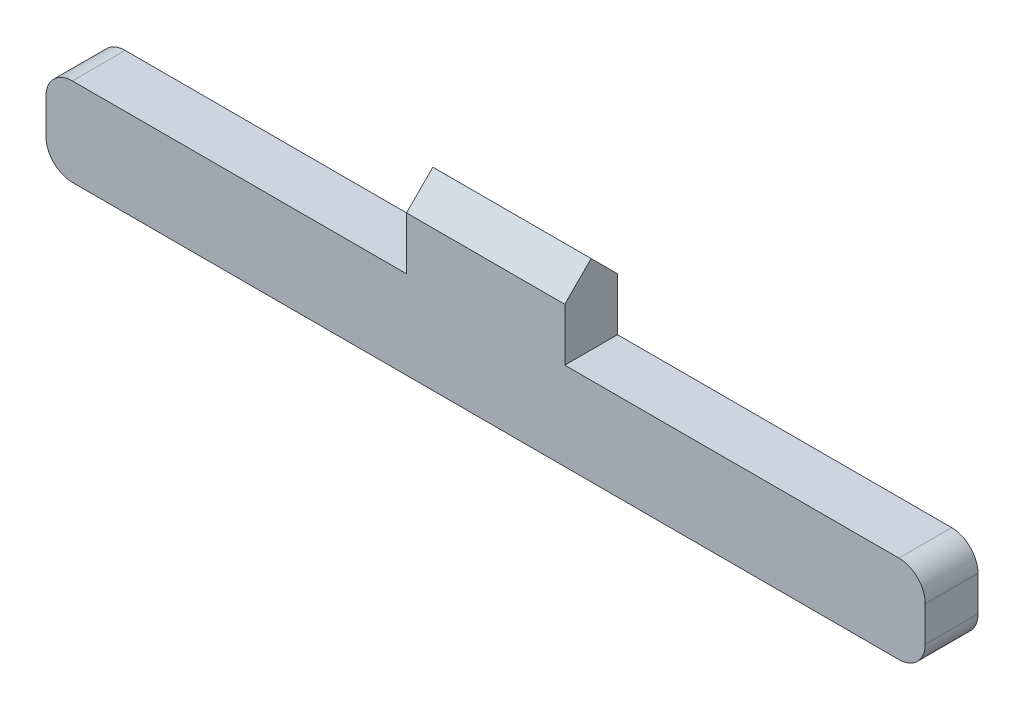
ISO-10303-21;
HEADER;
FILE_DESCRIPTION(('STEP AP214'),'2;1');
FILE_NAME('part.step','',(''),(''),'','','');
FILE_SCHEMA(('AUTOMOTIVE_DESIGN { 1 0 10303 214 1 1 1 1 }'));
ENDSEC;
DATA;
#1=APPLICATION_CONTEXT('core data for automotive mechanical design processes');
#2=APPLICATION_PROTOCOL_DEFINITION('international standard','automotive_design',2000,#1);
#3=PRODUCT_CONTEXT('',#1,'mechanical');
#4=PRODUCT('Part','Part','',(#3));
#5=PRODUCT_RELATED_PRODUCT_CATEGORY('part','',(#4));
#6=PRODUCT_DEFINITION_FORMATION('','',#4);
#7=PRODUCT_DEFINITION_CONTEXT('part definition',#1,'design');
#8=PRODUCT_DEFINITION('design','',#6,#7);
#9=PRODUCT_DEFINITION_SHAPE('','',#8);
#10=(LENGTH_UNIT() NAMED_UNIT(*) SI_UNIT(.MILLI.,.METRE.));
#11=(NAMED_UNIT(*) PLANE_ANGLE_UNIT() SI_UNIT($,.RADIAN.));
#12=(NAMED_UNIT(*) SI_UNIT($,.STERADIAN.) SOLID_ANGLE_UNIT());
#13=UNCERTAINTY_MEASURE_WITH_UNIT(LENGTH_MEASURE(1.E-05),#10,'distance_accuracy_value','');
#14=(GEOMETRIC_REPRESENTATION_CONTEXT(3) GLOBAL_UNCERTAINTY_ASSIGNED_CONTEXT((#13)) GLOBAL_UNIT_ASSIGNED_CONTEXT((#10,
#11,#12)) REPRESENTATION_CONTEXT('',''));
#15=CARTESIAN_POINT('',(0.,0.,0.));
#16=DIRECTION('',(0.,0.,1.));
#17=DIRECTION('',(1.,0.,0.));
#18=AXIS2_PLACEMENT_3D('',#15,#16,#17);
#19=CARTESIAN_POINT('',(-9.,10.,6.));
#20=DIRECTION('',(1.,0.,0.));
#21=DIRECTION('',(0.,1.,0.));
#22=AXIS2_PLACEMENT_3D('',#19,#20,#21);
#23=PLANE('',#22);
#24=DIRECTION('',(0.,-1.,0.));
#25=VECTOR('',#24,1.);
#26=CARTESIAN_POINT('',(-9.,10.,6.));
#27=LINE('',#26,#25);
#28=CARTESIAN_POINT('',(-9.,16.,6.));
#29=VERTEX_POINT('',#28);
#30=CARTESIAN_POINT('',(-9.,10.,6.));
#31=VERTEX_POINT('',#30);
#32=EDGE_CURVE('E133',#29,#31,#27,.T.);
#33=ORIENTED_EDGE('',*,*,#32,.F.);
#34=DIRECTION('',(0.,0.707106781186547,-0.707106781186548));
#35=VECTOR('',#34,1.);
#36=CARTESIAN_POINT('',(-9.,16.,6.));
#37=LINE('',#36,#35);
#38=CARTESIAN_POINT('',(-9.,19.,3.00000000000002));
#39=VERTEX_POINT('',#38);
#40=EDGE_CURVE('E201',#29,#39,#37,.T.);
#41=ORIENTED_EDGE('',*,*,#40,.T.);
#42=DIRECTION('',(0.,0.707106781186547,0.707106781186548));
#43=VECTOR('',#42,1.);
#44=CARTESIAN_POINT('',(-9.,19.,3.00000000000002));
#45=LINE('',#44,#43);
#46=CARTESIAN_POINT('',(-9.,16.,0.));
#47=VERTEX_POINT('',#46);
#48=EDGE_CURVE('E199',#39,#47,#45,.F.);
#49=ORIENTED_EDGE('',*,*,#48,.T.);
#50=DIRECTION('',(0.,-1.,0.));
#51=VECTOR('',#50,1.);
#52=CARTESIAN_POINT('',(-9.,10.,0.));
#53=LINE('',#52,#51);
#54=CARTESIAN_POINT('',(-9.,10.,0.));
#55=VERTEX_POINT('',#54);
#56=EDGE_CURVE('E154',#47,#55,#53,.T.);
#57=ORIENTED_EDGE('',*,*,#56,.T.);
#58=DIRECTION('',(0.,0.,-1.));
#59=VECTOR('',#58,1.);
#60=CARTESIAN_POINT('',(-9.,10.,6.));
#61=LINE('',#60,#59);
#62=EDGE_CURVE('E149',#31,#55,#61,.T.);
#63=ORIENTED_EDGE('',*,*,#62,.F.);
#64=EDGE_LOOP('',(#33,#41,#49,#57,#63));
#65=FACE_BOUND('',#64,.T.);
#66=ADVANCED_FACE('F35',(#65),#23,.F.);
#67=CARTESIAN_POINT('',(-50.,9.99999999999999,6.));
#68=DIRECTION('',(0.,-1.,0.));
#69=DIRECTION('',(1.,0.,0.));
#70=AXIS2_PLACEMENT_3D('',#67,#68,#69);
#71=PLANE('',#70);
#72=DIRECTION('',(-1.,0.,0.));
#73=VECTOR('',#72,1.);
#74=CARTESIAN_POINT('',(-50.,9.99999999999999,0.));
#75=LINE('',#74,#73);
#76=CARTESIAN_POINT('',(-47.,9.99999999999999,0.));
#77=VERTEX_POINT('',#76);
#78=EDGE_CURVE('E216',#55,#77,#75,.T.);
#79=ORIENTED_EDGE('',*,*,#78,.T.);
#80=DIRECTION('',(0.,0.,-1.));
#81=VECTOR('',#80,1.);
#82=CARTESIAN_POINT('',(-47.,9.99999999999999,6.));
#83=LINE('',#82,#81);
#84=CARTESIAN_POINT('',(-47.,9.99999999999999,6.));
#85=VERTEX_POINT('',#84);
#86=EDGE_CURVE('E151',#77,#85,#83,.F.);
#87=ORIENTED_EDGE('',*,*,#86,.T.);
#88=DIRECTION('',(-1.,0.,0.));
#89=VECTOR('',#88,1.);
#90=CARTESIAN_POINT('',(-50.,9.99999999999999,6.));
#91=LINE('',#90,#89);
#92=EDGE_CURVE('E137',#31,#85,#91,.T.);
#93=ORIENTED_EDGE('',*,*,#92,.F.);
#94=ORIENTED_EDGE('',*,*,#62,.T.);
#95=EDGE_LOOP('',(#79,#87,#93,#94));
#96=FACE_BOUND('',#95,.T.);
#97=ADVANCED_FACE('F148',(#96),#71,.F.);
#98=CARTESIAN_POINT('',(-50.,0.,6.));
#99=DIRECTION('',(1.,0.,0.));
#100=DIRECTION('',(0.,0.,-1.));
#101=AXIS2_PLACEMENT_3D('',#98,#99,#100);
#102=PLANE('',#101);
#103=DIRECTION('',(0.,-1.,0.));
#104=VECTOR('',#103,1.);
#105=CARTESIAN_POINT('',(-50.,0.,0.));
#106=LINE('',#105,#104);
#107=CARTESIAN_POINT('',(-50.,6.99999999999999,0.));
#108=VERTEX_POINT('',#107);
#109=CARTESIAN_POINT('',(-50.,3.,0.));
#110=VERTEX_POINT('',#109);
#111=EDGE_CURVE('E218',#108,#110,#106,.T.);
#112=ORIENTED_EDGE('',*,*,#111,.T.);
#113=DIRECTION('',(0.,0.,-1.));
#114=VECTOR('',#113,1.);
#115=CARTESIAN_POINT('',(-50.,3.,6.));
#116=LINE('',#115,#114);
#117=CARTESIAN_POINT('',(-50.,3.,6.));
#118=VERTEX_POINT('',#117);
#119=EDGE_CURVE('E179',#110,#118,#116,.F.);
#120=ORIENTED_EDGE('',*,*,#119,.T.);
#121=DIRECTION('',(0.,-1.,0.));
#122=VECTOR('',#121,1.);
#123=CARTESIAN_POINT('',(-50.,0.,6.));
#124=LINE('',#123,#122);
#125=CARTESIAN_POINT('',(-50.,6.99999999999999,6.));
#126=VERTEX_POINT('',#125);
#127=EDGE_CURVE('E152',#126,#118,#124,.T.);
#128=ORIENTED_EDGE('',*,*,#127,.F.);
#129=DIRECTION('',(0.,0.,-1.));
#130=VECTOR('',#129,1.);
#131=CARTESIAN_POINT('',(-50.,6.99999999999999,6.));
#132=LINE('',#131,#130);
#133=EDGE_CURVE('E176',#126,#108,#132,.T.);
#134=ORIENTED_EDGE('',*,*,#133,.T.);
#135=EDGE_LOOP('',(#112,#120,#128,#134));
#136=FACE_BOUND('',#135,.T.);
#137=ADVANCED_FACE('F285',(#136),#102,.F.);
#138=CARTESIAN_POINT('',(-50.,0.,6.));
#139=DIRECTION('',(0.,1.,0.));
#140=DIRECTION('',(-1.,0.,0.));
#141=AXIS2_PLACEMENT_3D('',#138,#139,#140);
#142=PLANE('',#141);
#143=DIRECTION('',(1.,0.,0.));
#144=VECTOR('',#143,1.);
#145=CARTESIAN_POINT('',(-50.,0.,6.));
#146=LINE('',#145,#144);
#147=CARTESIAN_POINT('',(-47.,0.,6.));
#148=VERTEX_POINT('',#147);
#149=CARTESIAN_POINT('',(47.,0.,6.));
#150=VERTEX_POINT('',#149);
#151=EDGE_CURVE('E249',#148,#150,#146,.T.);
#152=ORIENTED_EDGE('',*,*,#151,.F.);
#153=DIRECTION('',(0.,0.,-1.));
#154=VECTOR('',#153,1.);
#155=CARTESIAN_POINT('',(-47.,0.,6.));
#156=LINE('',#155,#154);
#157=CARTESIAN_POINT('',(-47.,0.,0.));
#158=VERTEX_POINT('',#157);
#159=EDGE_CURVE('E159',#148,#158,#156,.T.);
#160=ORIENTED_EDGE('',*,*,#159,.T.);
#161=DIRECTION('',(1.,0.,0.));
#162=VECTOR('',#161,1.);
#163=CARTESIAN_POINT('',(-50.,0.,0.));
#164=LINE('',#163,#162);
#165=CARTESIAN_POINT('',(47.,0.,0.));
#166=VERTEX_POINT('',#165);
#167=EDGE_CURVE('E224',#158,#166,#164,.T.);
#168=ORIENTED_EDGE('',*,*,#167,.T.);
#169=DIRECTION('',(0.,0.,-1.));
#170=VECTOR('',#169,1.);
#171=CARTESIAN_POINT('',(47.,0.,6.));
#172=LINE('',#171,#170);
#173=EDGE_CURVE('E156',#166,#150,#172,.F.);
#174=ORIENTED_EDGE('',*,*,#173,.T.);
#175=EDGE_LOOP('',(#152,#160,#168,#174));
#176=FACE_BOUND('',#175,.T.);
#177=ADVANCED_FACE('F265',(#176),#142,.F.);
#178=CARTESIAN_POINT('',(50.,0.,6.));
#179=DIRECTION('',(-1.,0.,0.));
#180=DIRECTION('',(0.,0.,1.));
#181=AXIS2_PLACEMENT_3D('',#178,#179,#180);
#182=PLANE('',#181);
#183=DIRECTION('',(0.,1.,0.));
#184=VECTOR('',#183,1.);
#185=CARTESIAN_POINT('',(50.,0.,6.));
#186=LINE('',#185,#184);
#187=CARTESIAN_POINT('',(50.,3.00000000000001,6.));
#188=VERTEX_POINT('',#187);
#189=CARTESIAN_POINT('',(50.,7.00000000000001,6.));
#190=VERTEX_POINT('',#189);
#191=EDGE_CURVE('E245',#188,#190,#186,.T.);
#192=ORIENTED_EDGE('',*,*,#191,.F.);
#193=DIRECTION('',(0.,0.,-1.));
#194=VECTOR('',#193,1.);
#195=CARTESIAN_POINT('',(50.,3.00000000000001,6.));
#196=LINE('',#195,#194);
#197=CARTESIAN_POINT('',(50.,3.00000000000001,0.));
#198=VERTEX_POINT('',#197);
#199=EDGE_CURVE('E192',#188,#198,#196,.T.);
#200=ORIENTED_EDGE('',*,*,#199,.T.);
#201=DIRECTION('',(0.,1.,0.));
#202=VECTOR('',#201,1.);
#203=CARTESIAN_POINT('',(50.,0.,0.));
#204=LINE('',#203,#202);
#205=CARTESIAN_POINT('',(50.,7.00000000000001,0.));
#206=VERTEX_POINT('',#205);
#207=EDGE_CURVE('E227',#198,#206,#204,.T.);
#208=ORIENTED_EDGE('',*,*,#207,.T.);
#209=DIRECTION('',(0.,0.,-1.));
#210=VECTOR('',#209,1.);
#211=CARTESIAN_POINT('',(50.,7.00000000000001,6.));
#212=LINE('',#211,#210);
#213=EDGE_CURVE('E190',#206,#190,#212,.F.);
#214=ORIENTED_EDGE('',*,*,#213,.T.);
#215=EDGE_LOOP('',(#192,#200,#208,#214));
#216=FACE_BOUND('',#215,.T.);
#217=ADVANCED_FACE('F244',(#216),#182,.F.);
#218=CARTESIAN_POINT('',(50.,10.,6.));
#219=DIRECTION('',(0.,-1.,0.));
#220=DIRECTION('',(0.,0.,-1.));
#221=AXIS2_PLACEMENT_3D('',#218,#219,#220);
#222=PLANE('',#221);
#223=DIRECTION('',(-1.,0.,0.));
#224=VECTOR('',#223,1.);
#225=CARTESIAN_POINT('',(50.,10.,6.));
#226=LINE('',#225,#224);
#227=CARTESIAN_POINT('',(47.,10.,6.));
#228=VERTEX_POINT('',#227);
#229=CARTESIAN_POINT('',(9.,10.,6.));
#230=VERTEX_POINT('',#229);
#231=EDGE_CURVE('E210',#228,#230,#226,.T.);
#232=ORIENTED_EDGE('',*,*,#231,.F.);
#233=DIRECTION('',(0.,0.,-1.));
#234=VECTOR('',#233,1.);
#235=CARTESIAN_POINT('',(47.,10.,6.));
#236=LINE('',#235,#234);
#237=CARTESIAN_POINT('',(47.,10.,0.));
#238=VERTEX_POINT('',#237);
#239=EDGE_CURVE('E195',#228,#238,#236,.T.);
#240=ORIENTED_EDGE('',*,*,#239,.T.);
#241=DIRECTION('',(-1.,0.,0.));
#242=VECTOR('',#241,1.);
#243=CARTESIAN_POINT('',(50.,10.,0.));
#244=LINE('',#243,#242);
#245=CARTESIAN_POINT('',(9.,10.,0.));
#246=VERTEX_POINT('',#245);
#247=EDGE_CURVE('E230',#238,#246,#244,.T.);
#248=ORIENTED_EDGE('',*,*,#247,.T.);
#249=DIRECTION('',(0.,0.,-1.));
#250=VECTOR('',#249,1.);
#251=CARTESIAN_POINT('',(9.,10.,6.));
#252=LINE('',#251,#250);
#253=EDGE_CURVE('E157',#230,#246,#252,.T.);
#254=ORIENTED_EDGE('',*,*,#253,.F.);
#255=EDGE_LOOP('',(#232,#240,#248,#254));
#256=FACE_BOUND('',#255,.T.);
#257=ADVANCED_FACE('F235',(#256),#222,.F.);
#258=CARTESIAN_POINT('',(9.,10.,6.));
#259=DIRECTION('',(-1.,0.,0.));
#260=DIRECTION('',(0.,-1.,0.));
#261=AXIS2_PLACEMENT_3D('',#258,#259,#260);
#262=PLANE('',#261);
#263=DIRECTION('',(0.,-0.707106781186547,-0.707106781186548));
#264=VECTOR('',#263,1.);
#265=CARTESIAN_POINT('',(9.,19.,3.00000000000002));
#266=LINE('',#265,#264);
#267=CARTESIAN_POINT('',(9.,16.,0.));
#268=VERTEX_POINT('',#267);
#269=CARTESIAN_POINT('',(9.,19.,3.00000000000002));
#270=VERTEX_POINT('',#269);
#271=EDGE_CURVE('E52',#268,#270,#266,.F.);
#272=ORIENTED_EDGE('',*,*,#271,.T.);
#273=DIRECTION('',(0.,-0.707106781186547,0.707106781186548));
#274=VECTOR('',#273,1.);
#275=CARTESIAN_POINT('',(9.,16.,6.));
#276=LINE('',#275,#274);
#277=CARTESIAN_POINT('',(9.,16.,6.));
#278=VERTEX_POINT('',#277);
#279=EDGE_CURVE('E45',#270,#278,#276,.T.);
#280=ORIENTED_EDGE('',*,*,#279,.T.);
#281=DIRECTION('',(0.,1.,0.));
#282=VECTOR('',#281,1.);
#283=CARTESIAN_POINT('',(9.,10.,6.));
#284=LINE('',#283,#282);
#285=EDGE_CURVE('E162',#230,#278,#284,.T.);
#286=ORIENTED_EDGE('',*,*,#285,.F.);
#287=ORIENTED_EDGE('',*,*,#253,.T.);
#288=DIRECTION('',(0.,1.,0.));
#289=VECTOR('',#288,1.);
#290=CARTESIAN_POINT('',(9.,10.,0.));
#291=LINE('',#290,#289);
#292=EDGE_CURVE('E143',#246,#268,#291,.T.);
#293=ORIENTED_EDGE('',*,*,#292,.T.);
#294=EDGE_LOOP('',(#272,#280,#286,#287,#293));
#295=FACE_BOUND('',#294,.T.);
#296=ADVANCED_FACE('F206',(#295),#262,.F.);
#297=CARTESIAN_POINT('',(0.,0.,6.));
#298=DIRECTION('',(0.,0.,1.));
#299=DIRECTION('',(1.,0.,0.));
#300=AXIS2_PLACEMENT_3D('',#297,#298,#299);
#301=PLANE('',#300);
#302=ORIENTED_EDGE('',*,*,#285,.T.);
#303=DIRECTION('',(-1.,0.,0.));
#304=VECTOR('',#303,1.);
#305=CARTESIAN_POINT('',(-9.,16.,6.));
#306=LINE('',#305,#304);
#307=EDGE_CURVE('E140',#278,#29,#306,.T.);
#308=ORIENTED_EDGE('',*,*,#307,.T.);
#309=ORIENTED_EDGE('',*,*,#32,.T.);
#310=ORIENTED_EDGE('',*,*,#92,.T.);
#311=CARTESIAN_POINT('',(-47.,6.99999999999999,6.));
#312=DIRECTION('',(0.,0.,1.));
#313=DIRECTION('',(1.,0.,0.));
#314=AXIS2_PLACEMENT_3D('',#311,#312,#313);
#315=CIRCLE('',#314,3.);
#316=EDGE_CURVE('E185',#85,#126,#315,.T.);
#317=ORIENTED_EDGE('',*,*,#316,.T.);
#318=ORIENTED_EDGE('',*,*,#127,.T.);
#319=CARTESIAN_POINT('',(-47.,3.,6.));
#320=DIRECTION('',(0.,0.,1.));
#321=DIRECTION('',(1.,0.,0.));
#322=AXIS2_PLACEMENT_3D('',#319,#320,#321);
#323=CIRCLE('',#322,3.);
#324=EDGE_CURVE('E187',#118,#148,#323,.T.);
#325=ORIENTED_EDGE('',*,*,#324,.T.);
#326=ORIENTED_EDGE('',*,*,#151,.T.);
#327=CARTESIAN_POINT('',(47.,3.00000000000001,6.));
#328=DIRECTION('',(0.,0.,1.));
#329=DIRECTION('',(1.,0.,0.));
#330=AXIS2_PLACEMENT_3D('',#327,#328,#329);
#331=CIRCLE('',#330,3.);
#332=EDGE_CURVE('E183',#150,#188,#331,.T.);
#333=ORIENTED_EDGE('',*,*,#332,.T.);
#334=ORIENTED_EDGE('',*,*,#191,.T.);
#335=CARTESIAN_POINT('',(47.,7.00000000000001,6.));
#336=DIRECTION('',(0.,0.,1.));
#337=DIRECTION('',(1.,0.,0.));
#338=AXIS2_PLACEMENT_3D('',#335,#336,#337);
#339=CIRCLE('',#338,3.);
#340=EDGE_CURVE('E181',#190,#228,#339,.T.);
#341=ORIENTED_EDGE('',*,*,#340,.T.);
#342=ORIENTED_EDGE('',*,*,#231,.T.);
#343=EDGE_LOOP('',(#302,#308,#309,#310,#317,#318,#325,#326,#333,#334,#341,#342));
#344=FACE_BOUND('',#343,.T.);
#345=ADVANCED_FACE('F136',(#344),#301,.T.);
#346=CARTESIAN_POINT('',(0.,0.,0.));
#347=DIRECTION('',(0.,0.,1.));
#348=DIRECTION('',(1.,0.,0.));
#349=AXIS2_PLACEMENT_3D('',#346,#347,#348);
#350=PLANE('',#349);
#351=ORIENTED_EDGE('',*,*,#56,.F.);
#352=DIRECTION('',(1.,0.,0.));
#353=VECTOR('',#352,1.);
#354=CARTESIAN_POINT('',(0.,16.,0.));
#355=LINE('',#354,#353);
#356=EDGE_CURVE('E11',#47,#268,#355,.T.);
#357=ORIENTED_EDGE('',*,*,#356,.T.);
#358=ORIENTED_EDGE('',*,*,#292,.F.);
#359=ORIENTED_EDGE('',*,*,#247,.F.);
#360=CARTESIAN_POINT('',(47.,7.00000000000001,0.));
#361=DIRECTION('',(0.,0.,1.));
#362=DIRECTION('',(1.,0.,0.));
#363=AXIS2_PLACEMENT_3D('',#360,#361,#362);
#364=CIRCLE('',#363,3.);
#365=EDGE_CURVE('E168',#238,#206,#364,.F.);
#366=ORIENTED_EDGE('',*,*,#365,.T.);
#367=ORIENTED_EDGE('',*,*,#207,.F.);
#368=CARTESIAN_POINT('',(47.,3.00000000000001,0.));
#369=DIRECTION('',(0.,0.,1.));
#370=DIRECTION('',(1.,0.,0.));
#371=AXIS2_PLACEMENT_3D('',#368,#369,#370);
#372=CIRCLE('',#371,3.);
#373=EDGE_CURVE('E170',#198,#166,#372,.F.);
#374=ORIENTED_EDGE('',*,*,#373,.T.);
#375=ORIENTED_EDGE('',*,*,#167,.F.);
#376=CARTESIAN_POINT('',(-47.,3.,0.));
#377=DIRECTION('',(0.,0.,1.));
#378=DIRECTION('',(1.,0.,0.));
#379=AXIS2_PLACEMENT_3D('',#376,#377,#378);
#380=CIRCLE('',#379,3.);
#381=EDGE_CURVE('E174',#158,#110,#380,.F.);
#382=ORIENTED_EDGE('',*,*,#381,.T.);
#383=ORIENTED_EDGE('',*,*,#111,.F.);
#384=CARTESIAN_POINT('',(-47.,6.99999999999999,0.));
#385=DIRECTION('',(0.,0.,1.));
#386=DIRECTION('',(1.,0.,0.));
#387=AXIS2_PLACEMENT_3D('',#384,#385,#386);
#388=CIRCLE('',#387,3.);
#389=EDGE_CURVE('E172',#108,#77,#388,.F.);
#390=ORIENTED_EDGE('',*,*,#389,.T.);
#391=ORIENTED_EDGE('',*,*,#78,.F.);
#392=EDGE_LOOP('',(#351,#357,#358,#359,#366,#367,#374,#375,#382,#383,#390,#391));
#393=FACE_BOUND('',#392,.T.);
#394=ADVANCED_FACE('F232',(#393),#350,.F.);
#395=CARTESIAN_POINT('',(-47.,3.,6.));
#396=DIRECTION('',(0.,0.,-1.));
#397=DIRECTION('',(-1.,0.,0.));
#398=AXIS2_PLACEMENT_3D('',#395,#396,#397);
#399=CYLINDRICAL_SURFACE('',#398,3.);
#400=ORIENTED_EDGE('',*,*,#324,.F.);
#401=ORIENTED_EDGE('',*,*,#119,.F.);
#402=ORIENTED_EDGE('',*,*,#381,.F.);
#403=ORIENTED_EDGE('',*,*,#159,.F.);
#404=EDGE_LOOP('',(#400,#401,#402,#403));
#405=FACE_BOUND('',#404,.T.);
#406=ADVANCED_FACE('F262',(#405),#399,.T.);
#407=CARTESIAN_POINT('',(-47.,6.99999999999999,6.));
#408=DIRECTION('',(0.,0.,-1.));
#409=DIRECTION('',(-1.,0.,0.));
#410=AXIS2_PLACEMENT_3D('',#407,#408,#409);
#411=CYLINDRICAL_SURFACE('',#410,3.);
#412=ORIENTED_EDGE('',*,*,#316,.F.);
#413=ORIENTED_EDGE('',*,*,#86,.F.);
#414=ORIENTED_EDGE('',*,*,#389,.F.);
#415=ORIENTED_EDGE('',*,*,#133,.F.);
#416=EDGE_LOOP('',(#412,#413,#414,#415));
#417=FACE_BOUND('',#416,.T.);
#418=ADVANCED_FACE('F271',(#417),#411,.T.);
#419=CARTESIAN_POINT('',(47.,3.00000000000001,6.));
#420=DIRECTION('',(0.,0.,-1.));
#421=DIRECTION('',(-1.,0.,0.));
#422=AXIS2_PLACEMENT_3D('',#419,#420,#421);
#423=CYLINDRICAL_SURFACE('',#422,3.);
#424=ORIENTED_EDGE('',*,*,#332,.F.);
#425=ORIENTED_EDGE('',*,*,#173,.F.);
#426=ORIENTED_EDGE('',*,*,#373,.F.);
#427=ORIENTED_EDGE('',*,*,#199,.F.);
#428=EDGE_LOOP('',(#424,#425,#426,#427));
#429=FACE_BOUND('',#428,.T.);
#430=ADVANCED_FACE('F269',(#429),#423,.T.);
#431=CARTESIAN_POINT('',(47.,7.00000000000001,6.));
#432=DIRECTION('',(0.,0.,-1.));
#433=DIRECTION('',(-1.,0.,0.));
#434=AXIS2_PLACEMENT_3D('',#431,#432,#433);
#435=CYLINDRICAL_SURFACE('',#434,3.);
#436=ORIENTED_EDGE('',*,*,#340,.F.);
#437=ORIENTED_EDGE('',*,*,#213,.F.);
#438=ORIENTED_EDGE('',*,*,#365,.F.);
#439=ORIENTED_EDGE('',*,*,#239,.F.);
#440=EDGE_LOOP('',(#436,#437,#438,#439));
#441=FACE_BOUND('',#440,.T.);
#442=ADVANCED_FACE('F239',(#441),#435,.T.);
#443=CARTESIAN_POINT('',(9.,19.,3.00000000000002));
#444=DIRECTION('',(0.,-0.707106781186548,0.707106781186547));
#445=DIRECTION('',(-1.,0.,0.));
#446=AXIS2_PLACEMENT_3D('',#443,#444,#445);
#447=PLANE('',#446);
#448=DIRECTION('',(-1.,0.,0.));
#449=VECTOR('',#448,1.);
#450=CARTESIAN_POINT('',(9.,19.,3.00000000000002));
#451=LINE('',#450,#449);
#452=EDGE_CURVE('E40',#270,#39,#451,.T.);
#453=ORIENTED_EDGE('',*,*,#452,.F.);
#454=ORIENTED_EDGE('',*,*,#271,.F.);
#455=ORIENTED_EDGE('',*,*,#356,.F.);
#456=ORIENTED_EDGE('',*,*,#48,.F.);
#457=EDGE_LOOP('',(#453,#454,#455,#456));
#458=FACE_BOUND('',#457,.T.);
#459=ADVANCED_FACE('F38',(#458),#447,.F.);
#460=CARTESIAN_POINT('',(0.,16.,6.));
#461=DIRECTION('',(0.,0.707106781186548,0.707106781186547));
#462=DIRECTION('',(1.,0.,0.));
#463=AXIS2_PLACEMENT_3D('',#460,#461,#462);
#464=PLANE('',#463);
#465=ORIENTED_EDGE('',*,*,#279,.F.);
#466=ORIENTED_EDGE('',*,*,#452,.T.);
#467=ORIENTED_EDGE('',*,*,#40,.F.);
#468=ORIENTED_EDGE('',*,*,#307,.F.);
#469=EDGE_LOOP('',(#465,#466,#467,#468));
#470=FACE_BOUND('',#469,.T.);
#471=ADVANCED_FACE('F213',(#470),#464,.T.);
#472=CLOSED_SHELL('',(#66,#97,#137,#177,#217,#257,#296,#345,#394,#406,#418,#430,#442,#459,#471));
#473=MANIFOLD_SOLID_BREP('B2',#472);
#474=ADVANCED_BREP_SHAPE_REPRESENTATION('',(#18,#473),#14);
#475=SHAPE_DEFINITION_REPRESENTATION(#9,#474);
ENDSEC;
END-ISO-10303-21;
